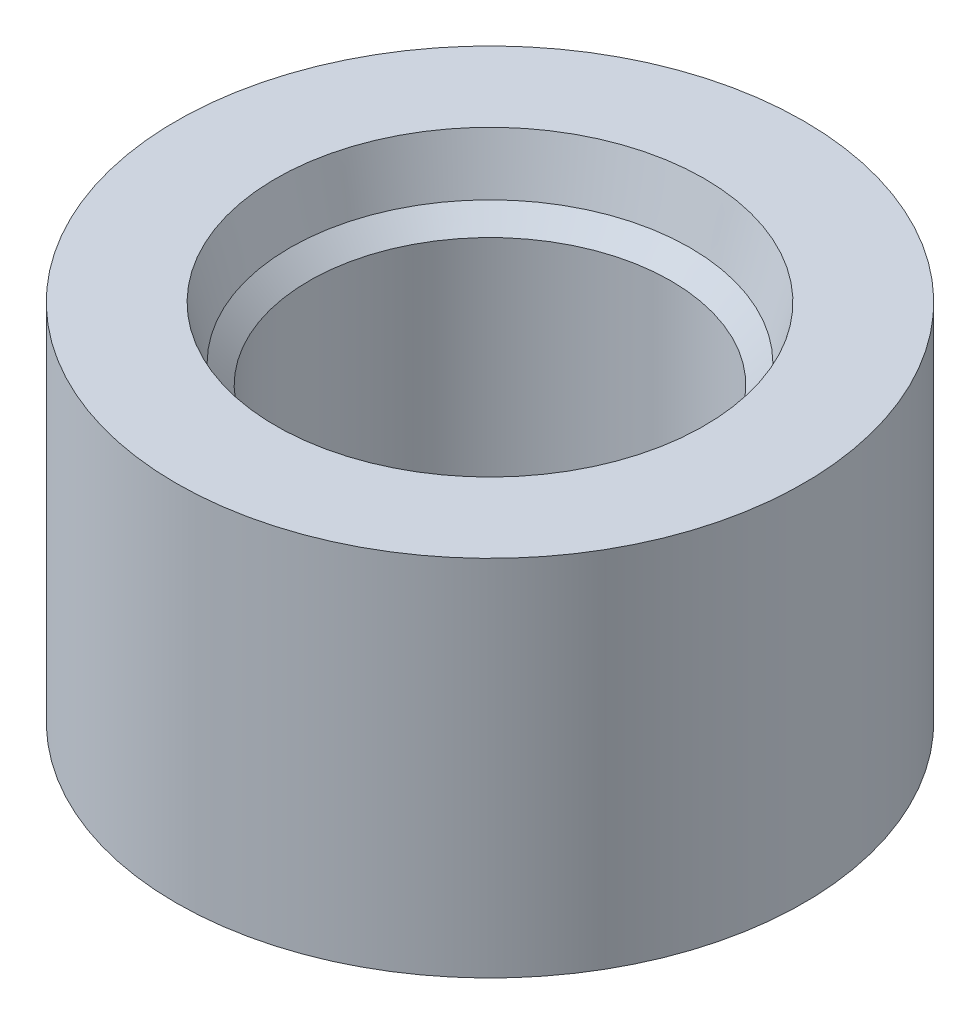
ISO-10303-21;
HEADER;
FILE_DESCRIPTION(('STEP AP214'),'2;1');
FILE_NAME('part.step','',(''),(''),'','','');
FILE_SCHEMA(('AUTOMOTIVE_DESIGN { 1 0 10303 214 1 1 1 1 }'));
ENDSEC;
DATA;
#1=APPLICATION_CONTEXT('core data for automotive mechanical design processes');
#2=APPLICATION_PROTOCOL_DEFINITION('international standard','automotive_design',2000,#1);
#3=PRODUCT_CONTEXT('',#1,'mechanical');
#4=PRODUCT('Part','Part','',(#3));
#5=PRODUCT_RELATED_PRODUCT_CATEGORY('part','',(#4));
#6=PRODUCT_DEFINITION_FORMATION('','',#4);
#7=PRODUCT_DEFINITION_CONTEXT('part definition',#1,'design');
#8=PRODUCT_DEFINITION('design','',#6,#7);
#9=PRODUCT_DEFINITION_SHAPE('','',#8);
#10=(LENGTH_UNIT() NAMED_UNIT(*) SI_UNIT(.MILLI.,.METRE.));
#11=(NAMED_UNIT(*) PLANE_ANGLE_UNIT() SI_UNIT($,.RADIAN.));
#12=(NAMED_UNIT(*) SI_UNIT($,.STERADIAN.) SOLID_ANGLE_UNIT());
#13=UNCERTAINTY_MEASURE_WITH_UNIT(LENGTH_MEASURE(1.E-05),#10,'distance_accuracy_value','');
#14=(GEOMETRIC_REPRESENTATION_CONTEXT(3) GLOBAL_UNCERTAINTY_ASSIGNED_CONTEXT((#13)) GLOBAL_UNIT_ASSIGNED_CONTEXT((#10,
#11,#12)) REPRESENTATION_CONTEXT('',''));
#15=CARTESIAN_POINT('',(0.,0.,0.));
#16=DIRECTION('',(0.,0.,1.));
#17=DIRECTION('',(1.,0.,0.));
#18=AXIS2_PLACEMENT_3D('',#15,#16,#17);
#19=CARTESIAN_POINT('',(15.0876,0.,0.));
#20=DIRECTION('',(0.,-1.,0.));
#21=DIRECTION('',(0.,0.,-1.));
#22=AXIS2_PLACEMENT_3D('',#19,#20,#21);
#23=PLANE('',#22);
#24=CARTESIAN_POINT('',(0.,0.,0.));
#25=DIRECTION('',(0.,-1.,0.));
#26=DIRECTION('',(0.,0.,-1.));
#27=AXIS2_PLACEMENT_3D('',#24,#25,#26);
#28=CIRCLE('',#27,15.0876);
#29=CARTESIAN_POINT('',(0.,0.,-15.0876));
#30=VERTEX_POINT('',#29);
#31=EDGE_CURVE('E55',#30,#30,#28,.T.);
#32=ORIENTED_EDGE('',*,*,#31,.T.);
#33=EDGE_LOOP('',(#32));
#34=FACE_BOUND('',#33,.T.);
#35=CARTESIAN_POINT('',(0.,0.,0.));
#36=DIRECTION('',(0.,-1.,0.));
#37=DIRECTION('',(0.,0.,-1.));
#38=AXIS2_PLACEMENT_3D('',#35,#36,#37);
#39=CIRCLE('',#38,8.6995);
#40=CARTESIAN_POINT('',(0.,0.,-8.6995));
#41=VERTEX_POINT('',#40);
#42=EDGE_CURVE('E10',#41,#41,#39,.T.);
#43=ORIENTED_EDGE('',*,*,#42,.F.);
#44=EDGE_LOOP('',(#43));
#45=FACE_BOUND('',#44,.T.);
#46=ADVANCED_FACE('F33',(#34,#45),#23,.T.);
#47=CARTESIAN_POINT('',(0.,0.,0.));
#48=DIRECTION('',(0.,-1.,0.));
#49=DIRECTION('',(0.,0.,-1.));
#50=AXIS2_PLACEMENT_3D('',#47,#48,#49);
#51=CYLINDRICAL_SURFACE('',#50,8.6995);
#52=ORIENTED_EDGE('',*,*,#42,.T.);
#53=EDGE_LOOP('',(#52));
#54=FACE_BOUND('',#53,.T.);
#55=CARTESIAN_POINT('',(0.,14.015590948775,0.));
#56=DIRECTION('',(0.,-1.,0.));
#57=DIRECTION('',(0.,0.,-1.));
#58=AXIS2_PLACEMENT_3D('',#55,#56,#57);
#59=CIRCLE('',#58,8.6995);
#60=CARTESIAN_POINT('',(0.,14.015590948775,-8.6995));
#61=VERTEX_POINT('',#60);
#62=EDGE_CURVE('E39',#61,#61,#59,.T.);
#63=ORIENTED_EDGE('',*,*,#62,.F.);
#64=EDGE_LOOP('',(#63));
#65=FACE_BOUND('',#64,.T.);
#66=ADVANCED_FACE('F73',(#54,#65),#51,.F.);
#67=CARTESIAN_POINT('',(0.,14.9352,0.));
#68=DIRECTION('',(0.,1.,0.));
#69=DIRECTION('',(0.,0.,1.));
#70=AXIS2_PLACEMENT_3D('',#67,#68,#69);
#71=CONICAL_SURFACE('',#70,9.61910905122497,0.785398163397451);
#72=ORIENTED_EDGE('',*,*,#62,.T.);
#73=EDGE_LOOP('',(#72));
#74=FACE_BOUND('',#73,.T.);
#75=CARTESIAN_POINT('',(0.,14.9352,0.));
#76=DIRECTION('',(0.,-1.,0.));
#77=DIRECTION('',(0.,0.,-1.));
#78=AXIS2_PLACEMENT_3D('',#75,#76,#77);
#79=CIRCLE('',#78,9.61910905122497);
#80=CARTESIAN_POINT('',(0.,14.9352,-9.61910905122497));
#81=VERTEX_POINT('',#80);
#82=EDGE_CURVE('E43',#81,#81,#79,.T.);
#83=ORIENTED_EDGE('',*,*,#82,.F.);
#84=EDGE_LOOP('',(#83));
#85=FACE_BOUND('',#84,.T.);
#86=ADVANCED_FACE('F77',(#74,#85),#71,.F.);
#87=CARTESIAN_POINT('',(0.,17.4752,0.));
#88=DIRECTION('',(0.,1.,0.));
#89=DIRECTION('',(0.,0.,1.));
#90=AXIS2_PLACEMENT_3D('',#87,#88,#89);
#91=CONICAL_SURFACE('',#90,10.2997,0.261799387799143);
#92=ORIENTED_EDGE('',*,*,#82,.T.);
#93=EDGE_LOOP('',(#92));
#94=FACE_BOUND('',#93,.T.);
#95=CARTESIAN_POINT('',(0.,17.4752,0.));
#96=DIRECTION('',(0.,-1.,0.));
#97=DIRECTION('',(0.,0.,-1.));
#98=AXIS2_PLACEMENT_3D('',#95,#96,#97);
#99=CIRCLE('',#98,10.2997);
#100=CARTESIAN_POINT('',(0.,17.4752,-10.2997));
#101=VERTEX_POINT('',#100);
#102=EDGE_CURVE('E47',#101,#101,#99,.T.);
#103=ORIENTED_EDGE('',*,*,#102,.F.);
#104=EDGE_LOOP('',(#103));
#105=FACE_BOUND('',#104,.T.);
#106=ADVANCED_FACE('F69',(#94,#105),#91,.F.);
#107=CARTESIAN_POINT('',(10.2997,17.4752,0.));
#108=DIRECTION('',(0.,1.,0.));
#109=DIRECTION('',(0.,0.,1.));
#110=AXIS2_PLACEMENT_3D('',#107,#108,#109);
#111=PLANE('',#110);
#112=ORIENTED_EDGE('',*,*,#102,.T.);
#113=EDGE_LOOP('',(#112));
#114=FACE_BOUND('',#113,.T.);
#115=CARTESIAN_POINT('',(0.,17.4752,0.));
#116=DIRECTION('',(0.,-1.,0.));
#117=DIRECTION('',(0.,0.,-1.));
#118=AXIS2_PLACEMENT_3D('',#115,#116,#117);
#119=CIRCLE('',#118,15.0876);
#120=CARTESIAN_POINT('',(0.,17.4752,-15.0876));
#121=VERTEX_POINT('',#120);
#122=EDGE_CURVE('E52',#121,#121,#119,.T.);
#123=ORIENTED_EDGE('',*,*,#122,.F.);
#124=EDGE_LOOP('',(#123));
#125=FACE_BOUND('',#124,.T.);
#126=ADVANCED_FACE('F63',(#114,#125),#111,.T.);
#127=CARTESIAN_POINT('',(0.,0.,0.));
#128=DIRECTION('',(0.,-1.,0.));
#129=DIRECTION('',(0.,0.,-1.));
#130=AXIS2_PLACEMENT_3D('',#127,#128,#129);
#131=CYLINDRICAL_SURFACE('',#130,15.0876);
#132=ORIENTED_EDGE('',*,*,#122,.T.);
#133=EDGE_LOOP('',(#132));
#134=FACE_BOUND('',#133,.T.);
#135=ORIENTED_EDGE('',*,*,#31,.F.);
#136=EDGE_LOOP('',(#135));
#137=FACE_BOUND('',#136,.T.);
#138=ADVANCED_FACE('F61',(#134,#137),#131,.T.);
#139=CLOSED_SHELL('',(#46,#66,#86,#106,#126,#138));
#140=MANIFOLD_SOLID_BREP('B2',#139);
#141=ADVANCED_BREP_SHAPE_REPRESENTATION('',(#18,#140),#14);
#142=SHAPE_DEFINITION_REPRESENTATION(#9,#141);
ENDSEC;
END-ISO-10303-21;
